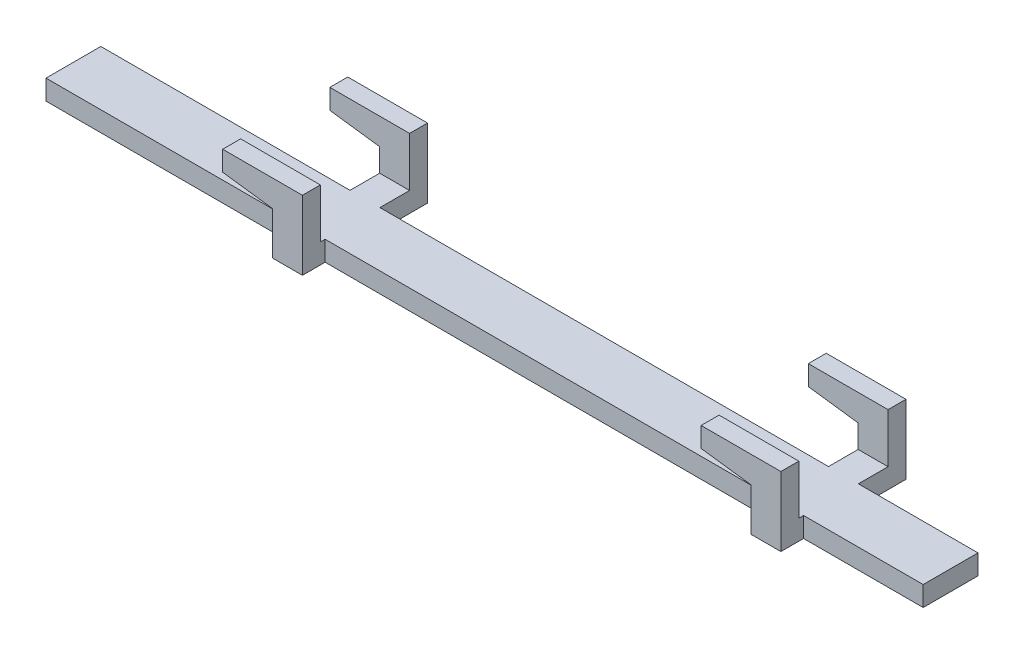
ISO-10303-21;
HEADER;
FILE_DESCRIPTION(('STEP AP214'),'2;1');
FILE_NAME('part.step','',(''),(''),'','','');
FILE_SCHEMA(('AUTOMOTIVE_DESIGN { 1 0 10303 214 1 1 1 1 }'));
ENDSEC;
DATA;
#1=APPLICATION_CONTEXT('core data for automotive mechanical design processes');
#2=APPLICATION_PROTOCOL_DEFINITION('international standard','automotive_design',2000,#1);
#3=PRODUCT_CONTEXT('',#1,'mechanical');
#4=PRODUCT('Part','Part','',(#3));
#5=PRODUCT_RELATED_PRODUCT_CATEGORY('part','',(#4));
#6=PRODUCT_DEFINITION_FORMATION('','',#4);
#7=PRODUCT_DEFINITION_CONTEXT('part definition',#1,'design');
#8=PRODUCT_DEFINITION('design','',#6,#7);
#9=PRODUCT_DEFINITION_SHAPE('','',#8);
#10=(LENGTH_UNIT() NAMED_UNIT(*) SI_UNIT(.MILLI.,.METRE.));
#11=(NAMED_UNIT(*) PLANE_ANGLE_UNIT() SI_UNIT($,.RADIAN.));
#12=(NAMED_UNIT(*) SI_UNIT($,.STERADIAN.) SOLID_ANGLE_UNIT());
#13=UNCERTAINTY_MEASURE_WITH_UNIT(LENGTH_MEASURE(1.E-05),#10,'distance_accuracy_value','');
#14=(GEOMETRIC_REPRESENTATION_CONTEXT(3) GLOBAL_UNCERTAINTY_ASSIGNED_CONTEXT((#13)) GLOBAL_UNIT_ASSIGNED_CONTEXT((#10,
#11,#12)) REPRESENTATION_CONTEXT('',''));
#15=CARTESIAN_POINT('',(0.,0.,0.));
#16=DIRECTION('',(0.,0.,1.));
#17=DIRECTION('',(1.,0.,0.));
#18=AXIS2_PLACEMENT_3D('',#15,#16,#17);
#19=CARTESIAN_POINT('',(-88.,2.,0.));
#20=DIRECTION('',(1.,0.,0.));
#21=DIRECTION('',(0.,0.,-1.));
#22=AXIS2_PLACEMENT_3D('',#19,#20,#21);
#23=PLANE('',#22);
#24=DIRECTION('',(0.,0.,1.));
#25=VECTOR('',#24,1.);
#26=CARTESIAN_POINT('',(-88.,4.,0.));
#27=LINE('',#26,#25);
#28=CARTESIAN_POINT('',(-88.,4.,0.));
#29=VERTEX_POINT('',#28);
#30=CARTESIAN_POINT('',(-88.,4.,5.5));
#31=VERTEX_POINT('',#30);
#32=EDGE_CURVE('E413',#29,#31,#27,.T.);
#33=ORIENTED_EDGE('',*,*,#32,.F.);
#34=DIRECTION('',(0.,1.,0.));
#35=VECTOR('',#34,1.);
#36=CARTESIAN_POINT('',(-88.,2.,0.));
#37=LINE('',#36,#35);
#38=CARTESIAN_POINT('',(-88.,2.,0.));
#39=VERTEX_POINT('',#38);
#40=EDGE_CURVE('E461',#39,#29,#37,.T.);
#41=ORIENTED_EDGE('',*,*,#40,.F.);
#42=DIRECTION('',(0.,0.,1.));
#43=VECTOR('',#42,1.);
#44=CARTESIAN_POINT('',(-88.,2.,0.));
#45=LINE('',#44,#43);
#46=CARTESIAN_POINT('',(-88.,2.,5.5));
#47=VERTEX_POINT('',#46);
#48=EDGE_CURVE('E414',#39,#47,#45,.T.);
#49=ORIENTED_EDGE('',*,*,#48,.T.);
#50=DIRECTION('',(0.,1.,0.));
#51=VECTOR('',#50,1.);
#52=CARTESIAN_POINT('',(-88.,2.,5.5));
#53=LINE('',#52,#51);
#54=EDGE_CURVE('E538',#47,#31,#53,.T.);
#55=ORIENTED_EDGE('',*,*,#54,.T.);
#56=EDGE_LOOP('',(#33,#41,#49,#55));
#57=FACE_BOUND('',#56,.T.);
#58=ADVANCED_FACE('F35',(#57),#23,.F.);
#59=CARTESIAN_POINT('',(-88.,2.,5.5));
#60=DIRECTION('',(0.,0.,-1.));
#61=DIRECTION('',(-1.,0.,0.));
#62=AXIS2_PLACEMENT_3D('',#59,#60,#61);
#63=PLANE('',#62);
#64=DIRECTION('',(1.,0.,0.));
#65=VECTOR('',#64,1.);
#66=CARTESIAN_POINT('',(-88.,4.,5.5));
#67=LINE('',#66,#65);
#68=CARTESIAN_POINT('',(-63.,4.,5.5));
#69=VERTEX_POINT('',#68);
#70=EDGE_CURVE('E464',#31,#69,#67,.T.);
#71=ORIENTED_EDGE('',*,*,#70,.F.);
#72=ORIENTED_EDGE('',*,*,#54,.F.);
#73=DIRECTION('',(1.,0.,0.));
#74=VECTOR('',#73,1.);
#75=CARTESIAN_POINT('',(-88.,2.,5.5));
#76=LINE('',#75,#74);
#77=CARTESIAN_POINT('',(-63.,2.,5.5));
#78=VERTEX_POINT('',#77);
#79=EDGE_CURVE('E417',#47,#78,#76,.T.);
#80=ORIENTED_EDGE('',*,*,#79,.T.);
#81=DIRECTION('',(0.,1.,0.));
#82=VECTOR('',#81,1.);
#83=CARTESIAN_POINT('',(-63.,2.,5.5));
#84=LINE('',#83,#82);
#85=EDGE_CURVE('E535',#78,#69,#84,.T.);
#86=ORIENTED_EDGE('',*,*,#85,.T.);
#87=EDGE_LOOP('',(#71,#72,#80,#86));
#88=FACE_BOUND('',#87,.T.);
#89=ADVANCED_FACE('F629',(#88),#63,.F.);
#90=CARTESIAN_POINT('',(-63.,2.,6.87500000000001));
#91=DIRECTION('',(1.,0.,0.));
#92=DIRECTION('',(0.,0.,-1.));
#93=AXIS2_PLACEMENT_3D('',#90,#91,#92);
#94=PLANE('',#93);
#95=DIRECTION('',(0.,0.,1.));
#96=VECTOR('',#95,1.);
#97=CARTESIAN_POINT('',(-63.,4.,6.87500000000001));
#98=LINE('',#97,#96);
#99=CARTESIAN_POINT('',(-63.,4.,5.975));
#100=VERTEX_POINT('',#99);
#101=EDGE_CURVE('E467',#69,#100,#98,.T.);
#102=ORIENTED_EDGE('',*,*,#101,.F.);
#103=ORIENTED_EDGE('',*,*,#85,.F.);
#104=DIRECTION('',(0.,0.,1.));
#105=VECTOR('',#104,1.);
#106=CARTESIAN_POINT('',(-63.,2.,6.87500000000001));
#107=LINE('',#106,#105);
#108=CARTESIAN_POINT('',(-63.,2.,7.775));
#109=VERTEX_POINT('',#108);
#110=EDGE_CURVE('E421',#78,#109,#107,.T.);
#111=ORIENTED_EDGE('',*,*,#110,.T.);
#112=DIRECTION('',(0.,1.,0.));
#113=VECTOR('',#112,1.);
#114=CARTESIAN_POINT('',(-63.,6.3,7.775));
#115=LINE('',#114,#113);
#116=CARTESIAN_POINT('',(-63.,6.3,7.775));
#117=VERTEX_POINT('',#116);
#118=EDGE_CURVE('E309',#109,#117,#115,.T.);
#119=ORIENTED_EDGE('',*,*,#118,.T.);
#120=DIRECTION('',(0.,0.,-1.));
#121=VECTOR('',#120,1.);
#122=CARTESIAN_POINT('',(-63.,6.3,7.775));
#123=LINE('',#122,#121);
#124=CARTESIAN_POINT('',(-63.,6.3,5.975));
#125=VERTEX_POINT('',#124);
#126=EDGE_CURVE('E332',#117,#125,#123,.T.);
#127=ORIENTED_EDGE('',*,*,#126,.T.);
#128=DIRECTION('',(0.,1.,0.));
#129=VECTOR('',#128,1.);
#130=CARTESIAN_POINT('',(-63.,6.3,5.975));
#131=LINE('',#130,#129);
#132=EDGE_CURVE('E297',#100,#125,#131,.T.);
#133=ORIENTED_EDGE('',*,*,#132,.F.);
#134=EDGE_LOOP('',(#102,#103,#111,#119,#127,#133));
#135=FACE_BOUND('',#134,.T.);
#136=ADVANCED_FACE('F632',(#135),#94,.F.);
#137=CARTESIAN_POINT('',(-60.,2.,5.5));
#138=DIRECTION('',(-1.,0.,0.));
#139=DIRECTION('',(0.,0.,1.));
#140=AXIS2_PLACEMENT_3D('',#137,#138,#139);
#141=PLANE('',#140);
#142=DIRECTION('',(0.,0.,-1.));
#143=VECTOR('',#142,1.);
#144=CARTESIAN_POINT('',(-60.,2.,5.5));
#145=LINE('',#144,#143);
#146=CARTESIAN_POINT('',(-60.,2.,7.775));
#147=VERTEX_POINT('',#146);
#148=CARTESIAN_POINT('',(-60.,2.,5.5));
#149=VERTEX_POINT('',#148);
#150=EDGE_CURVE('E424',#147,#149,#145,.T.);
#151=ORIENTED_EDGE('',*,*,#150,.T.);
#152=DIRECTION('',(0.,1.,0.));
#153=VECTOR('',#152,1.);
#154=CARTESIAN_POINT('',(-60.,2.,5.5));
#155=LINE('',#154,#153);
#156=CARTESIAN_POINT('',(-60.,4.,5.5));
#157=VERTEX_POINT('',#156);
#158=EDGE_CURVE('E532',#149,#157,#155,.T.);
#159=ORIENTED_EDGE('',*,*,#158,.T.);
#160=DIRECTION('',(0.,0.,-1.));
#161=VECTOR('',#160,1.);
#162=CARTESIAN_POINT('',(-60.,4.,5.5));
#163=LINE('',#162,#161);
#164=CARTESIAN_POINT('',(-60.,4.,5.975));
#165=VERTEX_POINT('',#164);
#166=EDGE_CURVE('E470',#165,#157,#163,.T.);
#167=ORIENTED_EDGE('',*,*,#166,.F.);
#168=DIRECTION('',(0.,-1.,0.));
#169=VECTOR('',#168,1.);
#170=CARTESIAN_POINT('',(-60.,2.,5.975));
#171=LINE('',#170,#169);
#172=CARTESIAN_POINT('',(-60.,8.95826248793698,5.975));
#173=VERTEX_POINT('',#172);
#174=EDGE_CURVE('E307',#173,#165,#171,.T.);
#175=ORIENTED_EDGE('',*,*,#174,.F.);
#176=DIRECTION('',(0.,0.,-1.));
#177=VECTOR('',#176,1.);
#178=CARTESIAN_POINT('',(-60.,8.95826248793698,7.775));
#179=LINE('',#178,#177);
#180=CARTESIAN_POINT('',(-60.,8.95826248793698,7.775));
#181=VERTEX_POINT('',#180);
#182=EDGE_CURVE('E325',#181,#173,#179,.T.);
#183=ORIENTED_EDGE('',*,*,#182,.F.);
#184=DIRECTION('',(0.,-1.,0.));
#185=VECTOR('',#184,1.);
#186=CARTESIAN_POINT('',(-60.,2.,7.775));
#187=LINE('',#186,#185);
#188=EDGE_CURVE('E320',#181,#147,#187,.T.);
#189=ORIENTED_EDGE('',*,*,#188,.T.);
#190=EDGE_LOOP('',(#151,#159,#167,#175,#183,#189));
#191=FACE_BOUND('',#190,.T.);
#192=ADVANCED_FACE('F649',(#191),#141,.F.);
#193=CARTESIAN_POINT('',(-60.,2.,5.5));
#194=DIRECTION('',(0.,0.,-1.));
#195=DIRECTION('',(-1.,0.,0.));
#196=AXIS2_PLACEMENT_3D('',#193,#194,#195);
#197=PLANE('',#196);
#198=DIRECTION('',(1.,0.,0.));
#199=VECTOR('',#198,1.);
#200=CARTESIAN_POINT('',(-60.,4.,5.5));
#201=LINE('',#200,#199);
#202=CARTESIAN_POINT('',(-15.,4.,5.5));
#203=VERTEX_POINT('',#202);
#204=EDGE_CURVE('E473',#157,#203,#201,.T.);
#205=ORIENTED_EDGE('',*,*,#204,.F.);
#206=ORIENTED_EDGE('',*,*,#158,.F.);
#207=DIRECTION('',(1.,0.,0.));
#208=VECTOR('',#207,1.);
#209=CARTESIAN_POINT('',(-60.,2.,5.5));
#210=LINE('',#209,#208);
#211=CARTESIAN_POINT('',(-15.,2.,5.5));
#212=VERTEX_POINT('',#211);
#213=EDGE_CURVE('E427',#149,#212,#210,.T.);
#214=ORIENTED_EDGE('',*,*,#213,.T.);
#215=DIRECTION('',(0.,1.,0.));
#216=VECTOR('',#215,1.);
#217=CARTESIAN_POINT('',(-15.,2.,5.5));
#218=LINE('',#217,#216);
#219=EDGE_CURVE('E529',#212,#203,#218,.T.);
#220=ORIENTED_EDGE('',*,*,#219,.T.);
#221=EDGE_LOOP('',(#205,#206,#214,#220));
#222=FACE_BOUND('',#221,.T.);
#223=ADVANCED_FACE('F652',(#222),#197,.F.);
#224=CARTESIAN_POINT('',(-15.,2.,5.5));
#225=DIRECTION('',(1.,0.,0.));
#226=DIRECTION('',(0.,0.,-1.));
#227=AXIS2_PLACEMENT_3D('',#224,#225,#226);
#228=PLANE('',#227);
#229=DIRECTION('',(0.,0.,1.));
#230=VECTOR('',#229,1.);
#231=CARTESIAN_POINT('',(-15.,4.,5.5));
#232=LINE('',#231,#230);
#233=CARTESIAN_POINT('',(-15.,4.,5.975));
#234=VERTEX_POINT('',#233);
#235=EDGE_CURVE('E476',#203,#234,#232,.T.);
#236=ORIENTED_EDGE('',*,*,#235,.F.);
#237=ORIENTED_EDGE('',*,*,#219,.F.);
#238=DIRECTION('',(0.,0.,1.));
#239=VECTOR('',#238,1.);
#240=CARTESIAN_POINT('',(-15.,2.,5.5));
#241=LINE('',#240,#239);
#242=CARTESIAN_POINT('',(-15.,2.,7.775));
#243=VERTEX_POINT('',#242);
#244=EDGE_CURVE('E430',#212,#243,#241,.T.);
#245=ORIENTED_EDGE('',*,*,#244,.T.);
#246=DIRECTION('',(0.,1.,0.));
#247=VECTOR('',#246,1.);
#248=CARTESIAN_POINT('',(-15.,6.3,7.775));
#249=LINE('',#248,#247);
#250=CARTESIAN_POINT('',(-15.,6.3,7.775));
#251=VERTEX_POINT('',#250);
#252=EDGE_CURVE('E387',#243,#251,#249,.T.);
#253=ORIENTED_EDGE('',*,*,#252,.T.);
#254=DIRECTION('',(0.,0.,-1.));
#255=VECTOR('',#254,1.);
#256=CARTESIAN_POINT('',(-15.,6.3,7.775));
#257=LINE('',#256,#255);
#258=CARTESIAN_POINT('',(-15.,6.3,5.975));
#259=VERTEX_POINT('',#258);
#260=EDGE_CURVE('E410',#251,#259,#257,.T.);
#261=ORIENTED_EDGE('',*,*,#260,.T.);
#262=DIRECTION('',(0.,1.,0.));
#263=VECTOR('',#262,1.);
#264=CARTESIAN_POINT('',(-15.,6.3,5.975));
#265=LINE('',#264,#263);
#266=EDGE_CURVE('E366',#234,#259,#265,.T.);
#267=ORIENTED_EDGE('',*,*,#266,.F.);
#268=EDGE_LOOP('',(#236,#237,#245,#253,#261,#267));
#269=FACE_BOUND('',#268,.T.);
#270=ADVANCED_FACE('F655',(#269),#228,.F.);
#271=CARTESIAN_POINT('',(-12.,2.,5.5));
#272=DIRECTION('',(-1.,0.,0.));
#273=DIRECTION('',(0.,0.,1.));
#274=AXIS2_PLACEMENT_3D('',#271,#272,#273);
#275=PLANE('',#274);
#276=DIRECTION('',(0.,0.,-1.));
#277=VECTOR('',#276,1.);
#278=CARTESIAN_POINT('',(-12.,2.,5.5));
#279=LINE('',#278,#277);
#280=CARTESIAN_POINT('',(-12.,2.,7.775));
#281=VERTEX_POINT('',#280);
#282=CARTESIAN_POINT('',(-12.,2.,5.5));
#283=VERTEX_POINT('',#282);
#284=EDGE_CURVE('E433',#281,#283,#279,.T.);
#285=ORIENTED_EDGE('',*,*,#284,.T.);
#286=DIRECTION('',(0.,1.,0.));
#287=VECTOR('',#286,1.);
#288=CARTESIAN_POINT('',(-12.,2.,5.5));
#289=LINE('',#288,#287);
#290=CARTESIAN_POINT('',(-12.,4.,5.5));
#291=VERTEX_POINT('',#290);
#292=EDGE_CURVE('E526',#283,#291,#289,.T.);
#293=ORIENTED_EDGE('',*,*,#292,.T.);
#294=DIRECTION('',(0.,0.,-1.));
#295=VECTOR('',#294,1.);
#296=CARTESIAN_POINT('',(-12.,4.,5.5));
#297=LINE('',#296,#295);
#298=CARTESIAN_POINT('',(-12.,4.,5.975));
#299=VERTEX_POINT('',#298);
#300=EDGE_CURVE('E479',#299,#291,#297,.T.);
#301=ORIENTED_EDGE('',*,*,#300,.F.);
#302=DIRECTION('',(0.,-1.,0.));
#303=VECTOR('',#302,1.);
#304=CARTESIAN_POINT('',(-12.,2.,5.975));
#305=LINE('',#304,#303);
#306=CARTESIAN_POINT('',(-12.,8.95826248793698,5.975));
#307=VERTEX_POINT('',#306);
#308=EDGE_CURVE('E384',#307,#299,#305,.T.);
#309=ORIENTED_EDGE('',*,*,#308,.F.);
#310=DIRECTION('',(0.,0.,-1.));
#311=VECTOR('',#310,1.);
#312=CARTESIAN_POINT('',(-12.,8.95826248793698,7.775));
#313=LINE('',#312,#311);
#314=CARTESIAN_POINT('',(-12.,8.95826248793698,7.775));
#315=VERTEX_POINT('',#314);
#316=EDGE_CURVE('E403',#315,#307,#313,.T.);
#317=ORIENTED_EDGE('',*,*,#316,.F.);
#318=DIRECTION('',(0.,-1.,0.));
#319=VECTOR('',#318,1.);
#320=CARTESIAN_POINT('',(-12.,2.,7.775));
#321=LINE('',#320,#319);
#322=EDGE_CURVE('E398',#315,#281,#321,.T.);
#323=ORIENTED_EDGE('',*,*,#322,.T.);
#324=EDGE_LOOP('',(#285,#293,#301,#309,#317,#323));
#325=FACE_BOUND('',#324,.T.);
#326=ADVANCED_FACE('F663',(#325),#275,.F.);
#327=CARTESIAN_POINT('',(-12.,2.,5.5));
#328=DIRECTION('',(0.,0.,-1.));
#329=DIRECTION('',(-1.,0.,0.));
#330=AXIS2_PLACEMENT_3D('',#327,#328,#329);
#331=PLANE('',#330);
#332=DIRECTION('',(1.,0.,0.));
#333=VECTOR('',#332,1.);
#334=CARTESIAN_POINT('',(-12.,4.,5.5));
#335=LINE('',#334,#333);
#336=CARTESIAN_POINT('',(0.,4.,5.5));
#337=VERTEX_POINT('',#336);
#338=EDGE_CURVE('E482',#291,#337,#335,.T.);
#339=ORIENTED_EDGE('',*,*,#338,.F.);
#340=ORIENTED_EDGE('',*,*,#292,.F.);
#341=DIRECTION('',(1.,0.,0.));
#342=VECTOR('',#341,1.);
#343=CARTESIAN_POINT('',(-12.,2.,5.5));
#344=LINE('',#343,#342);
#345=CARTESIAN_POINT('',(0.,2.,5.5));
#346=VERTEX_POINT('',#345);
#347=EDGE_CURVE('E436',#283,#346,#344,.T.);
#348=ORIENTED_EDGE('',*,*,#347,.T.);
#349=DIRECTION('',(0.,1.,0.));
#350=VECTOR('',#349,1.);
#351=CARTESIAN_POINT('',(0.,2.,5.5));
#352=LINE('',#351,#350);
#353=EDGE_CURVE('E523',#346,#337,#352,.T.);
#354=ORIENTED_EDGE('',*,*,#353,.T.);
#355=EDGE_LOOP('',(#339,#340,#348,#354));
#356=FACE_BOUND('',#355,.T.);
#357=ADVANCED_FACE('F665',(#356),#331,.F.);
#358=CARTESIAN_POINT('',(0.,2.,0.));
#359=DIRECTION('',(-1.,0.,0.));
#360=DIRECTION('',(0.,0.,1.));
#361=AXIS2_PLACEMENT_3D('',#358,#359,#360);
#362=PLANE('',#361);
#363=DIRECTION('',(0.,0.,-1.));
#364=VECTOR('',#363,1.);
#365=CARTESIAN_POINT('',(0.,4.,0.));
#366=LINE('',#365,#364);
#367=CARTESIAN_POINT('',(0.,4.,0.));
#368=VERTEX_POINT('',#367);
#369=EDGE_CURVE('E485',#337,#368,#366,.T.);
#370=ORIENTED_EDGE('',*,*,#369,.F.);
#371=ORIENTED_EDGE('',*,*,#353,.F.);
#372=DIRECTION('',(0.,0.,-1.));
#373=VECTOR('',#372,1.);
#374=CARTESIAN_POINT('',(0.,2.,0.));
#375=LINE('',#374,#373);
#376=CARTESIAN_POINT('',(0.,2.,0.));
#377=VERTEX_POINT('',#376);
#378=EDGE_CURVE('E439',#346,#377,#375,.T.);
#379=ORIENTED_EDGE('',*,*,#378,.T.);
#380=DIRECTION('',(0.,1.,0.));
#381=VECTOR('',#380,1.);
#382=CARTESIAN_POINT('',(0.,2.,0.));
#383=LINE('',#382,#381);
#384=EDGE_CURVE('E520',#377,#368,#383,.T.);
#385=ORIENTED_EDGE('',*,*,#384,.T.);
#386=EDGE_LOOP('',(#370,#371,#379,#385));
#387=FACE_BOUND('',#386,.T.);
#388=ADVANCED_FACE('F561',(#387),#362,.F.);
#389=CARTESIAN_POINT('',(-12.,2.,0.));
#390=DIRECTION('',(0.,0.,1.));
#391=DIRECTION('',(1.,0.,0.));
#392=AXIS2_PLACEMENT_3D('',#389,#390,#391);
#393=PLANE('',#392);
#394=DIRECTION('',(-1.,0.,0.));
#395=VECTOR('',#394,1.);
#396=CARTESIAN_POINT('',(-12.,4.,0.));
#397=LINE('',#396,#395);
#398=CARTESIAN_POINT('',(-12.,4.,0.));
#399=VERTEX_POINT('',#398);
#400=EDGE_CURVE('E488',#368,#399,#397,.T.);
#401=ORIENTED_EDGE('',*,*,#400,.F.);
#402=ORIENTED_EDGE('',*,*,#384,.F.);
#403=DIRECTION('',(-1.,0.,0.));
#404=VECTOR('',#403,1.);
#405=CARTESIAN_POINT('',(-12.,2.,0.));
#406=LINE('',#405,#404);
#407=CARTESIAN_POINT('',(-12.,2.,0.));
#408=VERTEX_POINT('',#407);
#409=EDGE_CURVE('E442',#377,#408,#406,.T.);
#410=ORIENTED_EDGE('',*,*,#409,.T.);
#411=DIRECTION('',(0.,1.,0.));
#412=VECTOR('',#411,1.);
#413=CARTESIAN_POINT('',(-12.,2.,0.));
#414=LINE('',#413,#412);
#415=EDGE_CURVE('E517',#408,#399,#414,.T.);
#416=ORIENTED_EDGE('',*,*,#415,.T.);
#417=EDGE_LOOP('',(#401,#402,#410,#416));
#418=FACE_BOUND('',#417,.T.);
#419=ADVANCED_FACE('F559',(#418),#393,.F.);
#420=CARTESIAN_POINT('',(-12.,2.,0.));
#421=DIRECTION('',(-1.,0.,0.));
#422=DIRECTION('',(0.,0.,1.));
#423=AXIS2_PLACEMENT_3D('',#420,#421,#422);
#424=PLANE('',#423);
#425=DIRECTION('',(0.,0.,-1.));
#426=VECTOR('',#425,1.);
#427=CARTESIAN_POINT('',(-12.,4.,0.));
#428=LINE('',#427,#426);
#429=CARTESIAN_POINT('',(-12.,4.,-2.975));
#430=VERTEX_POINT('',#429);
#431=EDGE_CURVE('E491',#399,#430,#428,.T.);
#432=ORIENTED_EDGE('',*,*,#431,.F.);
#433=ORIENTED_EDGE('',*,*,#415,.F.);
#434=DIRECTION('',(0.,0.,-1.));
#435=VECTOR('',#434,1.);
#436=CARTESIAN_POINT('',(-12.,2.,0.));
#437=LINE('',#436,#435);
#438=CARTESIAN_POINT('',(-12.,2.,-4.775));
#439=VERTEX_POINT('',#438);
#440=EDGE_CURVE('E445',#408,#439,#437,.T.);
#441=ORIENTED_EDGE('',*,*,#440,.T.);
#442=DIRECTION('',(0.,-1.,0.));
#443=VECTOR('',#442,1.);
#444=CARTESIAN_POINT('',(-12.,2.,-4.775));
#445=LINE('',#444,#443);
#446=CARTESIAN_POINT('',(-12.,8.95826248793698,-4.775));
#447=VERTEX_POINT('',#446);
#448=EDGE_CURVE('E351',#447,#439,#445,.T.);
#449=ORIENTED_EDGE('',*,*,#448,.F.);
#450=DIRECTION('',(0.,0.,1.));
#451=VECTOR('',#450,1.);
#452=CARTESIAN_POINT('',(-12.,8.95826248793698,-4.775));
#453=LINE('',#452,#451);
#454=CARTESIAN_POINT('',(-12.,8.95826248793698,-2.975));
#455=VERTEX_POINT('',#454);
#456=EDGE_CURVE('E363',#447,#455,#453,.T.);
#457=ORIENTED_EDGE('',*,*,#456,.T.);
#458=DIRECTION('',(0.,-1.,0.));
#459=VECTOR('',#458,1.);
#460=CARTESIAN_POINT('',(-12.,2.,-2.975));
#461=LINE('',#460,#459);
#462=EDGE_CURVE('E337',#455,#430,#461,.T.);
#463=ORIENTED_EDGE('',*,*,#462,.T.);
#464=EDGE_LOOP('',(#432,#433,#441,#449,#457,#463));
#465=FACE_BOUND('',#464,.T.);
#466=ADVANCED_FACE('F552',(#465),#424,.F.);
#467=CARTESIAN_POINT('',(-15.,2.,-3.875));
#468=DIRECTION('',(1.,0.,0.));
#469=DIRECTION('',(0.,0.,-1.));
#470=AXIS2_PLACEMENT_3D('',#467,#468,#469);
#471=PLANE('',#470);
#472=DIRECTION('',(0.,1.,0.));
#473=VECTOR('',#472,1.);
#474=CARTESIAN_POINT('',(-15.,2.,0.));
#475=LINE('',#474,#473);
#476=CARTESIAN_POINT('',(-15.,2.,0.));
#477=VERTEX_POINT('',#476);
#478=CARTESIAN_POINT('',(-15.,4.,0.));
#479=VERTEX_POINT('',#478);
#480=EDGE_CURVE('E514',#477,#479,#475,.T.);
#481=ORIENTED_EDGE('',*,*,#480,.T.);
#482=DIRECTION('',(0.,0.,1.));
#483=VECTOR('',#482,1.);
#484=CARTESIAN_POINT('',(-15.,4.,-3.875));
#485=LINE('',#484,#483);
#486=CARTESIAN_POINT('',(-15.,4.,-2.975));
#487=VERTEX_POINT('',#486);
#488=EDGE_CURVE('E494',#487,#479,#485,.T.);
#489=ORIENTED_EDGE('',*,*,#488,.F.);
#490=DIRECTION('',(0.,1.,0.));
#491=VECTOR('',#490,1.);
#492=CARTESIAN_POINT('',(-15.,2.,-2.975));
#493=LINE('',#492,#491);
#494=CARTESIAN_POINT('',(-15.,6.3,-2.975));
#495=VERTEX_POINT('',#494);
#496=EDGE_CURVE('E340',#487,#495,#493,.T.);
#497=ORIENTED_EDGE('',*,*,#496,.T.);
#498=DIRECTION('',(0.,0.,1.));
#499=VECTOR('',#498,1.);
#500=CARTESIAN_POINT('',(-15.,6.3,-4.775));
#501=LINE('',#500,#499);
#502=CARTESIAN_POINT('',(-15.,6.3,-4.775));
#503=VERTEX_POINT('',#502);
#504=EDGE_CURVE('E369',#503,#495,#501,.T.);
#505=ORIENTED_EDGE('',*,*,#504,.F.);
#506=DIRECTION('',(0.,1.,0.));
#507=VECTOR('',#506,1.);
#508=CARTESIAN_POINT('',(-15.,2.,-4.775));
#509=LINE('',#508,#507);
#510=CARTESIAN_POINT('',(-15.,2.,-4.775));
#511=VERTEX_POINT('',#510);
#512=EDGE_CURVE('E356',#511,#503,#509,.T.);
#513=ORIENTED_EDGE('',*,*,#512,.F.);
#514=DIRECTION('',(0.,0.,1.));
#515=VECTOR('',#514,1.);
#516=CARTESIAN_POINT('',(-15.,2.,-3.875));
#517=LINE('',#516,#515);
#518=EDGE_CURVE('E448',#511,#477,#517,.T.);
#519=ORIENTED_EDGE('',*,*,#518,.T.);
#520=EDGE_LOOP('',(#481,#489,#497,#505,#513,#519));
#521=FACE_BOUND('',#520,.T.);
#522=ADVANCED_FACE('F585',(#521),#471,.F.);
#523=CARTESIAN_POINT('',(-60.,2.,0.));
#524=DIRECTION('',(0.,0.,1.));
#525=DIRECTION('',(1.,0.,0.));
#526=AXIS2_PLACEMENT_3D('',#523,#524,#525);
#527=PLANE('',#526);
#528=DIRECTION('',(-1.,0.,0.));
#529=VECTOR('',#528,1.);
#530=CARTESIAN_POINT('',(-60.,4.,0.));
#531=LINE('',#530,#529);
#532=CARTESIAN_POINT('',(-60.,4.,0.));
#533=VERTEX_POINT('',#532);
#534=EDGE_CURVE('E497',#479,#533,#531,.T.);
#535=ORIENTED_EDGE('',*,*,#534,.F.);
#536=ORIENTED_EDGE('',*,*,#480,.F.);
#537=DIRECTION('',(-1.,0.,0.));
#538=VECTOR('',#537,1.);
#539=CARTESIAN_POINT('',(-60.,2.,0.));
#540=LINE('',#539,#538);
#541=CARTESIAN_POINT('',(-60.,2.,0.));
#542=VERTEX_POINT('',#541);
#543=EDGE_CURVE('E451',#477,#542,#540,.T.);
#544=ORIENTED_EDGE('',*,*,#543,.T.);
#545=DIRECTION('',(0.,1.,0.));
#546=VECTOR('',#545,1.);
#547=CARTESIAN_POINT('',(-60.,2.,0.));
#548=LINE('',#547,#546);
#549=EDGE_CURVE('E511',#542,#533,#548,.T.);
#550=ORIENTED_EDGE('',*,*,#549,.T.);
#551=EDGE_LOOP('',(#535,#536,#544,#550));
#552=FACE_BOUND('',#551,.T.);
#553=ADVANCED_FACE('F588',(#552),#527,.F.);
#554=CARTESIAN_POINT('',(-60.,2.,0.));
#555=DIRECTION('',(-1.,0.,0.));
#556=DIRECTION('',(0.,0.,1.));
#557=AXIS2_PLACEMENT_3D('',#554,#555,#556);
#558=PLANE('',#557);
#559=DIRECTION('',(0.,0.,-1.));
#560=VECTOR('',#559,1.);
#561=CARTESIAN_POINT('',(-60.,4.,0.));
#562=LINE('',#561,#560);
#563=CARTESIAN_POINT('',(-60.,4.,-2.975));
#564=VERTEX_POINT('',#563);
#565=EDGE_CURVE('E500',#533,#564,#562,.T.);
#566=ORIENTED_EDGE('',*,*,#565,.F.);
#567=ORIENTED_EDGE('',*,*,#549,.F.);
#568=DIRECTION('',(0.,0.,-1.));
#569=VECTOR('',#568,1.);
#570=CARTESIAN_POINT('',(-60.,2.,0.));
#571=LINE('',#570,#569);
#572=CARTESIAN_POINT('',(-60.,2.,-4.775));
#573=VERTEX_POINT('',#572);
#574=EDGE_CURVE('E454',#542,#573,#571,.T.);
#575=ORIENTED_EDGE('',*,*,#574,.T.);
#576=DIRECTION('',(0.,-1.,0.));
#577=VECTOR('',#576,1.);
#578=CARTESIAN_POINT('',(-60.,2.00000000000001,-4.775));
#579=LINE('',#578,#577);
#580=CARTESIAN_POINT('',(-60.,8.95826248793698,-4.775));
#581=VERTEX_POINT('',#580);
#582=EDGE_CURVE('E286',#581,#573,#579,.T.);
#583=ORIENTED_EDGE('',*,*,#582,.F.);
#584=DIRECTION('',(0.,0.,1.));
#585=VECTOR('',#584,1.);
#586=CARTESIAN_POINT('',(-60.,8.95826248793698,-4.775));
#587=LINE('',#586,#585);
#588=CARTESIAN_POINT('',(-60.,8.95826248793698,-2.975));
#589=VERTEX_POINT('',#588);
#590=EDGE_CURVE('E270',#581,#589,#587,.T.);
#591=ORIENTED_EDGE('',*,*,#590,.T.);
#592=DIRECTION('',(0.,-1.,0.));
#593=VECTOR('',#592,1.);
#594=CARTESIAN_POINT('',(-60.,2.00000000000001,-2.975));
#595=LINE('',#594,#593);
#596=EDGE_CURVE('E276',#589,#564,#595,.T.);
#597=ORIENTED_EDGE('',*,*,#596,.T.);
#598=EDGE_LOOP('',(#566,#567,#575,#583,#591,#597));
#599=FACE_BOUND('',#598,.T.);
#600=ADVANCED_FACE('F283',(#599),#558,.F.);
#601=CARTESIAN_POINT('',(-63.,2.,-3.87499999999999));
#602=DIRECTION('',(1.,0.,0.));
#603=DIRECTION('',(0.,0.,-1.));
#604=AXIS2_PLACEMENT_3D('',#601,#602,#603);
#605=PLANE('',#604);
#606=DIRECTION('',(0.,1.,0.));
#607=VECTOR('',#606,1.);
#608=CARTESIAN_POINT('',(-63.,2.,0.));
#609=LINE('',#608,#607);
#610=CARTESIAN_POINT('',(-63.,2.,0.));
#611=VERTEX_POINT('',#610);
#612=CARTESIAN_POINT('',(-63.,4.,0.));
#613=VERTEX_POINT('',#612);
#614=EDGE_CURVE('E508',#611,#613,#609,.T.);
#615=ORIENTED_EDGE('',*,*,#614,.T.);
#616=DIRECTION('',(0.,0.,1.));
#617=VECTOR('',#616,1.);
#618=CARTESIAN_POINT('',(-63.,4.,-3.87499999999999));
#619=LINE('',#618,#617);
#620=CARTESIAN_POINT('',(-63.,4.,-2.975));
#621=VERTEX_POINT('',#620);
#622=EDGE_CURVE('E502',#621,#613,#619,.T.);
#623=ORIENTED_EDGE('',*,*,#622,.F.);
#624=DIRECTION('',(0.,1.,0.));
#625=VECTOR('',#624,1.);
#626=CARTESIAN_POINT('',(-63.,2.,-2.975));
#627=LINE('',#626,#625);
#628=CARTESIAN_POINT('',(-63.,6.3,-2.975));
#629=VERTEX_POINT('',#628);
#630=EDGE_CURVE('E281',#621,#629,#627,.T.);
#631=ORIENTED_EDGE('',*,*,#630,.T.);
#632=DIRECTION('',(0.,0.,1.));
#633=VECTOR('',#632,1.);
#634=CARTESIAN_POINT('',(-63.,6.3,-4.775));
#635=LINE('',#634,#633);
#636=CARTESIAN_POINT('',(-63.,6.3,-4.775));
#637=VERTEX_POINT('',#636);
#638=EDGE_CURVE('E287',#637,#629,#635,.T.);
#639=ORIENTED_EDGE('',*,*,#638,.F.);
#640=DIRECTION('',(0.,1.,0.));
#641=VECTOR('',#640,1.);
#642=CARTESIAN_POINT('',(-63.,2.,-4.775));
#643=LINE('',#642,#641);
#644=CARTESIAN_POINT('',(-63.,2.,-4.775));
#645=VERTEX_POINT('',#644);
#646=EDGE_CURVE('E594',#645,#637,#643,.T.);
#647=ORIENTED_EDGE('',*,*,#646,.F.);
#648=DIRECTION('',(0.,0.,1.));
#649=VECTOR('',#648,1.);
#650=CARTESIAN_POINT('',(-63.,2.,-3.87499999999999));
#651=LINE('',#650,#649);
#652=EDGE_CURVE('E456',#645,#611,#651,.T.);
#653=ORIENTED_EDGE('',*,*,#652,.T.);
#654=EDGE_LOOP('',(#615,#623,#631,#639,#647,#653));
#655=FACE_BOUND('',#654,.T.);
#656=ADVANCED_FACE('F619',(#655),#605,.F.);
#657=CARTESIAN_POINT('',(-88.,2.,0.));
#658=DIRECTION('',(0.,0.,1.));
#659=DIRECTION('',(1.,0.,0.));
#660=AXIS2_PLACEMENT_3D('',#657,#658,#659);
#661=PLANE('',#660);
#662=DIRECTION('',(-1.,0.,0.));
#663=VECTOR('',#662,1.);
#664=CARTESIAN_POINT('',(-88.,4.,0.));
#665=LINE('',#664,#663);
#666=EDGE_CURVE('E418',#613,#29,#665,.T.);
#667=ORIENTED_EDGE('',*,*,#666,.F.);
#668=ORIENTED_EDGE('',*,*,#614,.F.);
#669=DIRECTION('',(-1.,0.,0.));
#670=VECTOR('',#669,1.);
#671=CARTESIAN_POINT('',(-88.,2.,0.));
#672=LINE('',#671,#670);
#673=EDGE_CURVE('E459',#611,#39,#672,.T.);
#674=ORIENTED_EDGE('',*,*,#673,.T.);
#675=ORIENTED_EDGE('',*,*,#40,.T.);
#676=EDGE_LOOP('',(#667,#668,#674,#675));
#677=FACE_BOUND('',#676,.T.);
#678=ADVANCED_FACE('F624',(#677),#661,.F.);
#679=CARTESIAN_POINT('',(0.,2.,0.));
#680=DIRECTION('',(0.,-1.,0.));
#681=DIRECTION('',(0.,0.,1.));
#682=AXIS2_PLACEMENT_3D('',#679,#680,#681);
#683=PLANE('',#682);
#684=ORIENTED_EDGE('',*,*,#652,.F.);
#685=DIRECTION('',(-1.,0.,0.));
#686=VECTOR('',#685,1.);
#687=CARTESIAN_POINT('',(-15.,2.,-4.775));
#688=LINE('',#687,#686);
#689=EDGE_CURVE('E590',#573,#645,#688,.T.);
#690=ORIENTED_EDGE('',*,*,#689,.F.);
#691=ORIENTED_EDGE('',*,*,#574,.F.);
#692=ORIENTED_EDGE('',*,*,#543,.F.);
#693=ORIENTED_EDGE('',*,*,#518,.F.);
#694=DIRECTION('',(-1.,0.,0.));
#695=VECTOR('',#694,1.);
#696=CARTESIAN_POINT('',(-15.,2.,-4.775));
#697=LINE('',#696,#695);
#698=EDGE_CURVE('E354',#439,#511,#697,.T.);
#699=ORIENTED_EDGE('',*,*,#698,.F.);
#700=ORIENTED_EDGE('',*,*,#440,.F.);
#701=ORIENTED_EDGE('',*,*,#409,.F.);
#702=ORIENTED_EDGE('',*,*,#378,.F.);
#703=ORIENTED_EDGE('',*,*,#347,.F.);
#704=ORIENTED_EDGE('',*,*,#284,.F.);
#705=DIRECTION('',(-1.,0.,0.));
#706=VECTOR('',#705,1.);
#707=CARTESIAN_POINT('',(-15.,2.,7.775));
#708=LINE('',#707,#706);
#709=EDGE_CURVE('E401',#281,#243,#708,.T.);
#710=ORIENTED_EDGE('',*,*,#709,.T.);
#711=ORIENTED_EDGE('',*,*,#244,.F.);
#712=ORIENTED_EDGE('',*,*,#213,.F.);
#713=ORIENTED_EDGE('',*,*,#150,.F.);
#714=DIRECTION('',(-1.,0.,0.));
#715=VECTOR('',#714,1.);
#716=CARTESIAN_POINT('',(-63.,2.,7.775));
#717=LINE('',#716,#715);
#718=EDGE_CURVE('E323',#147,#109,#717,.T.);
#719=ORIENTED_EDGE('',*,*,#718,.T.);
#720=ORIENTED_EDGE('',*,*,#110,.F.);
#721=ORIENTED_EDGE('',*,*,#79,.F.);
#722=ORIENTED_EDGE('',*,*,#48,.F.);
#723=ORIENTED_EDGE('',*,*,#673,.F.);
#724=EDGE_LOOP('',(#684,#690,#691,#692,#693,#699,#700,#701,#702,#703,#704,#710,#711,#712,#713,
#719,#720,#721,#722,#723));
#725=FACE_BOUND('',#724,.T.);
#726=ADVANCED_FACE('F565',(#725),#683,.T.);
#727=CARTESIAN_POINT('',(0.,4.,0.));
#728=DIRECTION('',(0.,-1.,0.));
#729=DIRECTION('',(0.,0.,1.));
#730=AXIS2_PLACEMENT_3D('',#727,#728,#729);
#731=PLANE('',#730);
#732=ORIENTED_EDGE('',*,*,#622,.T.);
#733=ORIENTED_EDGE('',*,*,#666,.T.);
#734=ORIENTED_EDGE('',*,*,#32,.T.);
#735=ORIENTED_EDGE('',*,*,#70,.T.);
#736=ORIENTED_EDGE('',*,*,#101,.T.);
#737=DIRECTION('',(-1.,0.,0.));
#738=VECTOR('',#737,1.);
#739=CARTESIAN_POINT('',(0.,4.,5.975));
#740=LINE('',#739,#738);
#741=EDGE_CURVE('E42',#165,#100,#740,.T.);
#742=ORIENTED_EDGE('',*,*,#741,.F.);
#743=ORIENTED_EDGE('',*,*,#166,.T.);
#744=ORIENTED_EDGE('',*,*,#204,.T.);
#745=ORIENTED_EDGE('',*,*,#235,.T.);
#746=DIRECTION('',(-1.,0.,0.));
#747=VECTOR('',#746,1.);
#748=CARTESIAN_POINT('',(0.,4.,5.975));
#749=LINE('',#748,#747);
#750=EDGE_CURVE('E541',#299,#234,#749,.T.);
#751=ORIENTED_EDGE('',*,*,#750,.F.);
#752=ORIENTED_EDGE('',*,*,#300,.T.);
#753=ORIENTED_EDGE('',*,*,#338,.T.);
#754=ORIENTED_EDGE('',*,*,#369,.T.);
#755=ORIENTED_EDGE('',*,*,#400,.T.);
#756=ORIENTED_EDGE('',*,*,#431,.T.);
#757=DIRECTION('',(1.,0.,0.));
#758=VECTOR('',#757,1.);
#759=CARTESIAN_POINT('',(0.,4.,-2.975));
#760=LINE('',#759,#758);
#761=EDGE_CURVE('E543',#487,#430,#760,.T.);
#762=ORIENTED_EDGE('',*,*,#761,.F.);
#763=ORIENTED_EDGE('',*,*,#488,.T.);
#764=ORIENTED_EDGE('',*,*,#534,.T.);
#765=ORIENTED_EDGE('',*,*,#565,.T.);
#766=DIRECTION('',(1.,0.,0.));
#767=VECTOR('',#766,1.);
#768=CARTESIAN_POINT('',(0.,4.,-2.975));
#769=LINE('',#768,#767);
#770=EDGE_CURVE('E11',#621,#564,#769,.T.);
#771=ORIENTED_EDGE('',*,*,#770,.F.);
#772=EDGE_LOOP('',(#732,#733,#734,#735,#736,#742,#743,#744,#745,#751,#752,#753,#754,#755,#756,
#762,#763,#764,#765,#771));
#773=FACE_BOUND('',#772,.T.);
#774=ADVANCED_FACE('F556',(#773),#731,.F.);
#775=CARTESIAN_POINT('',(0.,4.,5.975));
#776=DIRECTION('',(0.,0.,-1.));
#777=DIRECTION('',(-1.,0.,0.));
#778=AXIS2_PLACEMENT_3D('',#775,#776,#777);
#779=PLANE('',#778);
#780=ORIENTED_EDGE('',*,*,#750,.T.);
#781=ORIENTED_EDGE('',*,*,#266,.T.);
#782=DIRECTION('',(-0.99144486137381,0.130526192220053,0.));
#783=VECTOR('',#782,1.);
#784=CARTESIAN_POINT('',(-20.,6.95826248793698,5.975));
#785=LINE('',#784,#783);
#786=CARTESIAN_POINT('',(-20.,6.95826248793698,5.975));
#787=VERTEX_POINT('',#786);
#788=EDGE_CURVE('E376',#259,#787,#785,.T.);
#789=ORIENTED_EDGE('',*,*,#788,.T.);
#790=DIRECTION('',(0.,1.,0.));
#791=VECTOR('',#790,1.);
#792=CARTESIAN_POINT('',(-20.,8.95826248793698,5.975));
#793=LINE('',#792,#791);
#794=CARTESIAN_POINT('',(-20.,8.95826248793698,5.975));
#795=VERTEX_POINT('',#794);
#796=EDGE_CURVE('E379',#787,#795,#793,.T.);
#797=ORIENTED_EDGE('',*,*,#796,.T.);
#798=DIRECTION('',(1.,0.,0.));
#799=VECTOR('',#798,1.);
#800=CARTESIAN_POINT('',(-12.,8.95826248793698,5.975));
#801=LINE('',#800,#799);
#802=EDGE_CURVE('E382',#795,#307,#801,.T.);
#803=ORIENTED_EDGE('',*,*,#802,.T.);
#804=ORIENTED_EDGE('',*,*,#308,.T.);
#805=EDGE_LOOP('',(#780,#781,#789,#797,#803,#804));
#806=FACE_BOUND('',#805,.T.);
#807=ADVANCED_FACE('F659',(#806),#779,.T.);
#808=CARTESIAN_POINT('',(-20.,6.95826248793698,7.775));
#809=DIRECTION('',(0.130526192220053,0.99144486137381,0.));
#810=DIRECTION('',(0.99144486137381,-0.130526192220053,0.));
#811=AXIS2_PLACEMENT_3D('',#808,#809,#810);
#812=PLANE('',#811);
#813=ORIENTED_EDGE('',*,*,#260,.F.);
#814=DIRECTION('',(-0.99144486137381,0.130526192220053,0.));
#815=VECTOR('',#814,1.);
#816=CARTESIAN_POINT('',(-20.,6.95826248793698,7.775));
#817=LINE('',#816,#815);
#818=CARTESIAN_POINT('',(-20.,6.95826248793698,7.775));
#819=VERTEX_POINT('',#818);
#820=EDGE_CURVE('E390',#251,#819,#817,.T.);
#821=ORIENTED_EDGE('',*,*,#820,.T.);
#822=DIRECTION('',(0.,0.,-1.));
#823=VECTOR('',#822,1.);
#824=CARTESIAN_POINT('',(-20.,6.95826248793698,7.775));
#825=LINE('',#824,#823);
#826=EDGE_CURVE('E408',#819,#787,#825,.T.);
#827=ORIENTED_EDGE('',*,*,#826,.T.);
#828=ORIENTED_EDGE('',*,*,#788,.F.);
#829=EDGE_LOOP('',(#813,#821,#827,#828));
#830=FACE_BOUND('',#829,.T.);
#831=ADVANCED_FACE('F794',(#830),#812,.F.);
#832=CARTESIAN_POINT('',(-20.,8.95826248793698,7.775));
#833=DIRECTION('',(1.,0.,0.));
#834=DIRECTION('',(0.,0.,-1.));
#835=AXIS2_PLACEMENT_3D('',#832,#833,#834);
#836=PLANE('',#835);
#837=ORIENTED_EDGE('',*,*,#826,.F.);
#838=DIRECTION('',(0.,1.,0.));
#839=VECTOR('',#838,1.);
#840=CARTESIAN_POINT('',(-20.,8.95826248793698,7.775));
#841=LINE('',#840,#839);
#842=CARTESIAN_POINT('',(-20.,8.95826248793698,7.775));
#843=VERTEX_POINT('',#842);
#844=EDGE_CURVE('E393',#819,#843,#841,.T.);
#845=ORIENTED_EDGE('',*,*,#844,.T.);
#846=DIRECTION('',(0.,0.,-1.));
#847=VECTOR('',#846,1.);
#848=CARTESIAN_POINT('',(-20.,8.95826248793698,7.775));
#849=LINE('',#848,#847);
#850=EDGE_CURVE('E406',#843,#795,#849,.T.);
#851=ORIENTED_EDGE('',*,*,#850,.T.);
#852=ORIENTED_EDGE('',*,*,#796,.F.);
#853=EDGE_LOOP('',(#837,#845,#851,#852));
#854=FACE_BOUND('',#853,.T.);
#855=ADVANCED_FACE('F803',(#854),#836,.F.);
#856=CARTESIAN_POINT('',(-12.,8.95826248793698,7.775));
#857=DIRECTION('',(0.,-1.,0.));
#858=DIRECTION('',(-1.,0.,0.));
#859=AXIS2_PLACEMENT_3D('',#856,#857,#858);
#860=PLANE('',#859);
#861=ORIENTED_EDGE('',*,*,#850,.F.);
#862=DIRECTION('',(1.,0.,0.));
#863=VECTOR('',#862,1.);
#864=CARTESIAN_POINT('',(-12.,8.95826248793698,7.775));
#865=LINE('',#864,#863);
#866=EDGE_CURVE('E396',#843,#315,#865,.T.);
#867=ORIENTED_EDGE('',*,*,#866,.T.);
#868=ORIENTED_EDGE('',*,*,#316,.T.);
#869=ORIENTED_EDGE('',*,*,#802,.F.);
#870=EDGE_LOOP('',(#861,#867,#868,#869));
#871=FACE_BOUND('',#870,.T.);
#872=ADVANCED_FACE('F813',(#871),#860,.F.);
#873=CARTESIAN_POINT('',(0.,4.,7.775));
#874=DIRECTION('',(0.,0.,-1.));
#875=DIRECTION('',(-1.,0.,0.));
#876=AXIS2_PLACEMENT_3D('',#873,#874,#875);
#877=PLANE('',#876);
#878=ORIENTED_EDGE('',*,*,#252,.F.);
#879=ORIENTED_EDGE('',*,*,#709,.F.);
#880=ORIENTED_EDGE('',*,*,#322,.F.);
#881=ORIENTED_EDGE('',*,*,#866,.F.);
#882=ORIENTED_EDGE('',*,*,#844,.F.);
#883=ORIENTED_EDGE('',*,*,#820,.F.);
#884=EDGE_LOOP('',(#878,#879,#880,#881,#882,#883));
#885=FACE_BOUND('',#884,.T.);
#886=ADVANCED_FACE('F823',(#885),#877,.F.);
#887=CARTESIAN_POINT('',(0.,4.,-2.975));
#888=DIRECTION('',(0.,0.,1.));
#889=DIRECTION('',(1.,0.,0.));
#890=AXIS2_PLACEMENT_3D('',#887,#888,#889);
#891=PLANE('',#890);
#892=ORIENTED_EDGE('',*,*,#761,.T.);
#893=ORIENTED_EDGE('',*,*,#462,.F.);
#894=DIRECTION('',(1.,0.,0.));
#895=VECTOR('',#894,1.);
#896=CARTESIAN_POINT('',(-15.,8.95826248793698,-2.975));
#897=LINE('',#896,#895);
#898=CARTESIAN_POINT('',(-20.,8.95826248793698,-2.975));
#899=VERTEX_POINT('',#898);
#900=EDGE_CURVE('E335',#899,#455,#897,.T.);
#901=ORIENTED_EDGE('',*,*,#900,.F.);
#902=DIRECTION('',(0.,1.,0.));
#903=VECTOR('',#902,1.);
#904=CARTESIAN_POINT('',(-20.,2.,-2.975));
#905=LINE('',#904,#903);
#906=CARTESIAN_POINT('',(-20.,6.95826248793698,-2.975));
#907=VERTEX_POINT('',#906);
#908=EDGE_CURVE('E346',#907,#899,#905,.T.);
#909=ORIENTED_EDGE('',*,*,#908,.F.);
#910=DIRECTION('',(-0.99144486137381,0.130526192220053,0.));
#911=VECTOR('',#910,1.);
#912=CARTESIAN_POINT('',(-14.4435390530296,6.2267405265215,-2.975));
#913=LINE('',#912,#911);
#914=EDGE_CURVE('E343',#495,#907,#913,.T.);
#915=ORIENTED_EDGE('',*,*,#914,.F.);
#916=ORIENTED_EDGE('',*,*,#496,.F.);
#917=EDGE_LOOP('',(#892,#893,#901,#909,#915,#916));
#918=FACE_BOUND('',#917,.T.);
#919=ADVANCED_FACE('F547',(#918),#891,.T.);
#920=CARTESIAN_POINT('',(-15.,8.95826248793698,-4.775));
#921=DIRECTION('',(0.,1.,0.));
#922=DIRECTION('',(1.,0.,0.));
#923=AXIS2_PLACEMENT_3D('',#920,#921,#922);
#924=PLANE('',#923);
#925=ORIENTED_EDGE('',*,*,#456,.F.);
#926=DIRECTION('',(1.,0.,0.));
#927=VECTOR('',#926,1.);
#928=CARTESIAN_POINT('',(-15.,8.95826248793698,-4.775));
#929=LINE('',#928,#927);
#930=CARTESIAN_POINT('',(-20.,8.95826248793698,-4.775));
#931=VERTEX_POINT('',#930);
#932=EDGE_CURVE('E349',#931,#447,#929,.T.);
#933=ORIENTED_EDGE('',*,*,#932,.F.);
#934=DIRECTION('',(0.,0.,1.));
#935=VECTOR('',#934,1.);
#936=CARTESIAN_POINT('',(-20.,8.95826248793698,-4.775));
#937=LINE('',#936,#935);
#938=EDGE_CURVE('E364',#931,#899,#937,.T.);
#939=ORIENTED_EDGE('',*,*,#938,.T.);
#940=ORIENTED_EDGE('',*,*,#900,.T.);
#941=EDGE_LOOP('',(#925,#933,#939,#940));
#942=FACE_BOUND('',#941,.T.);
#943=ADVANCED_FACE('F575',(#942),#924,.T.);
#944=CARTESIAN_POINT('',(-20.,2.,-4.775));
#945=DIRECTION('',(-1.,0.,0.));
#946=DIRECTION('',(0.,0.,1.));
#947=AXIS2_PLACEMENT_3D('',#944,#945,#946);
#948=PLANE('',#947);
#949=ORIENTED_EDGE('',*,*,#938,.F.);
#950=DIRECTION('',(0.,1.,0.));
#951=VECTOR('',#950,1.);
#952=CARTESIAN_POINT('',(-20.,2.,-4.775));
#953=LINE('',#952,#951);
#954=CARTESIAN_POINT('',(-20.,6.95826248793698,-4.775));
#955=VERTEX_POINT('',#954);
#956=EDGE_CURVE('E361',#955,#931,#953,.T.);
#957=ORIENTED_EDGE('',*,*,#956,.F.);
#958=DIRECTION('',(0.,0.,1.));
#959=VECTOR('',#958,1.);
#960=CARTESIAN_POINT('',(-20.,6.95826248793698,-4.775));
#961=LINE('',#960,#959);
#962=EDGE_CURVE('E367',#955,#907,#961,.T.);
#963=ORIENTED_EDGE('',*,*,#962,.T.);
#964=ORIENTED_EDGE('',*,*,#908,.T.);
#965=EDGE_LOOP('',(#949,#957,#963,#964));
#966=FACE_BOUND('',#965,.T.);
#967=ADVANCED_FACE('F578',(#966),#948,.T.);
#968=CARTESIAN_POINT('',(-14.4435390530296,6.2267405265215,-4.775));
#969=DIRECTION('',(-0.130526192220053,-0.99144486137381,0.));
#970=DIRECTION('',(-0.99144486137381,0.130526192220053,0.));
#971=AXIS2_PLACEMENT_3D('',#968,#969,#970);
#972=PLANE('',#971);
#973=ORIENTED_EDGE('',*,*,#962,.F.);
#974=DIRECTION('',(-0.99144486137381,0.130526192220053,0.));
#975=VECTOR('',#974,1.);
#976=CARTESIAN_POINT('',(-14.4435390530296,6.2267405265215,-4.775));
#977=LINE('',#976,#975);
#978=EDGE_CURVE('E359',#503,#955,#977,.T.);
#979=ORIENTED_EDGE('',*,*,#978,.F.);
#980=ORIENTED_EDGE('',*,*,#504,.T.);
#981=ORIENTED_EDGE('',*,*,#914,.T.);
#982=EDGE_LOOP('',(#973,#979,#980,#981));
#983=FACE_BOUND('',#982,.T.);
#984=ADVANCED_FACE('F581',(#983),#972,.T.);
#985=CARTESIAN_POINT('',(0.,4.,-4.775));
#986=DIRECTION('',(0.,0.,1.));
#987=DIRECTION('',(1.,0.,0.));
#988=AXIS2_PLACEMENT_3D('',#985,#986,#987);
#989=PLANE('',#988);
#990=ORIENTED_EDGE('',*,*,#932,.T.);
#991=ORIENTED_EDGE('',*,*,#448,.T.);
#992=ORIENTED_EDGE('',*,*,#698,.T.);
#993=ORIENTED_EDGE('',*,*,#512,.T.);
#994=ORIENTED_EDGE('',*,*,#978,.T.);
#995=ORIENTED_EDGE('',*,*,#956,.T.);
#996=EDGE_LOOP('',(#990,#991,#992,#993,#994,#995));
#997=FACE_BOUND('',#996,.T.);
#998=ADVANCED_FACE('F570',(#997),#989,.F.);
#999=CARTESIAN_POINT('',(-48.,4.,5.975));
#1000=DIRECTION('',(0.,0.,-1.));
#1001=DIRECTION('',(-1.,0.,0.));
#1002=AXIS2_PLACEMENT_3D('',#999,#1000,#1001);
#1003=PLANE('',#1002);
#1004=ORIENTED_EDGE('',*,*,#741,.T.);
#1005=ORIENTED_EDGE('',*,*,#132,.T.);
#1006=DIRECTION('',(-0.99144486137381,0.130526192220053,0.));
#1007=VECTOR('',#1006,1.);
#1008=CARTESIAN_POINT('',(-68.,6.95826248793698,5.975));
#1009=LINE('',#1008,#1007);
#1010=CARTESIAN_POINT('',(-68.,6.95826248793698,5.975));
#1011=VERTEX_POINT('',#1010);
#1012=EDGE_CURVE('E299',#125,#1011,#1009,.T.);
#1013=ORIENTED_EDGE('',*,*,#1012,.T.);
#1014=DIRECTION('',(0.,1.,0.));
#1015=VECTOR('',#1014,1.);
#1016=CARTESIAN_POINT('',(-68.,8.95826248793698,5.975));
#1017=LINE('',#1016,#1015);
#1018=CARTESIAN_POINT('',(-68.,8.95826248793698,5.975));
#1019=VERTEX_POINT('',#1018);
#1020=EDGE_CURVE('E302',#1011,#1019,#1017,.T.);
#1021=ORIENTED_EDGE('',*,*,#1020,.T.);
#1022=DIRECTION('',(1.,0.,0.));
#1023=VECTOR('',#1022,1.);
#1024=CARTESIAN_POINT('',(-60.,8.95826248793698,5.975));
#1025=LINE('',#1024,#1023);
#1026=EDGE_CURVE('E305',#1019,#173,#1025,.T.);
#1027=ORIENTED_EDGE('',*,*,#1026,.T.);
#1028=ORIENTED_EDGE('',*,*,#174,.T.);
#1029=EDGE_LOOP('',(#1004,#1005,#1013,#1021,#1027,#1028));
#1030=FACE_BOUND('',#1029,.T.);
#1031=ADVANCED_FACE('F634',(#1030),#1003,.T.);
#1032=CARTESIAN_POINT('',(-68.,6.95826248793698,7.775));
#1033=DIRECTION('',(0.130526192220053,0.99144486137381,0.));
#1034=DIRECTION('',(0.99144486137381,-0.130526192220053,0.));
#1035=AXIS2_PLACEMENT_3D('',#1032,#1033,#1034);
#1036=PLANE('',#1035);
#1037=ORIENTED_EDGE('',*,*,#126,.F.);
#1038=DIRECTION('',(-0.99144486137381,0.130526192220053,0.));
#1039=VECTOR('',#1038,1.);
#1040=CARTESIAN_POINT('',(-68.,6.95826248793698,7.775));
#1041=LINE('',#1040,#1039);
#1042=CARTESIAN_POINT('',(-68.,6.95826248793698,7.775));
#1043=VERTEX_POINT('',#1042);
#1044=EDGE_CURVE('E312',#117,#1043,#1041,.T.);
#1045=ORIENTED_EDGE('',*,*,#1044,.T.);
#1046=DIRECTION('',(0.,0.,-1.));
#1047=VECTOR('',#1046,1.);
#1048=CARTESIAN_POINT('',(-68.,6.95826248793698,7.775));
#1049=LINE('',#1048,#1047);
#1050=EDGE_CURVE('E330',#1043,#1011,#1049,.T.);
#1051=ORIENTED_EDGE('',*,*,#1050,.T.);
#1052=ORIENTED_EDGE('',*,*,#1012,.F.);
#1053=EDGE_LOOP('',(#1037,#1045,#1051,#1052));
#1054=FACE_BOUND('',#1053,.T.);
#1055=ADVANCED_FACE('F637',(#1054),#1036,.F.);
#1056=CARTESIAN_POINT('',(-68.,8.95826248793698,7.775));
#1057=DIRECTION('',(1.,0.,0.));
#1058=DIRECTION('',(0.,0.,-1.));
#1059=AXIS2_PLACEMENT_3D('',#1056,#1057,#1058);
#1060=PLANE('',#1059);
#1061=ORIENTED_EDGE('',*,*,#1050,.F.);
#1062=DIRECTION('',(0.,1.,0.));
#1063=VECTOR('',#1062,1.);
#1064=CARTESIAN_POINT('',(-68.,8.95826248793698,7.775));
#1065=LINE('',#1064,#1063);
#1066=CARTESIAN_POINT('',(-68.,8.95826248793698,7.775));
#1067=VERTEX_POINT('',#1066);
#1068=EDGE_CURVE('E315',#1043,#1067,#1065,.T.);
#1069=ORIENTED_EDGE('',*,*,#1068,.T.);
#1070=DIRECTION('',(0.,0.,-1.));
#1071=VECTOR('',#1070,1.);
#1072=CARTESIAN_POINT('',(-68.,8.95826248793698,7.775));
#1073=LINE('',#1072,#1071);
#1074=EDGE_CURVE('E328',#1067,#1019,#1073,.T.);
#1075=ORIENTED_EDGE('',*,*,#1074,.T.);
#1076=ORIENTED_EDGE('',*,*,#1020,.F.);
#1077=EDGE_LOOP('',(#1061,#1069,#1075,#1076));
#1078=FACE_BOUND('',#1077,.T.);
#1079=ADVANCED_FACE('F640',(#1078),#1060,.F.);
#1080=CARTESIAN_POINT('',(-60.,8.95826248793698,7.775));
#1081=DIRECTION('',(0.,-1.,0.));
#1082=DIRECTION('',(-1.,0.,0.));
#1083=AXIS2_PLACEMENT_3D('',#1080,#1081,#1082);
#1084=PLANE('',#1083);
#1085=ORIENTED_EDGE('',*,*,#1074,.F.);
#1086=DIRECTION('',(1.,0.,0.));
#1087=VECTOR('',#1086,1.);
#1088=CARTESIAN_POINT('',(-60.,8.95826248793698,7.775));
#1089=LINE('',#1088,#1087);
#1090=EDGE_CURVE('E318',#1067,#181,#1089,.T.);
#1091=ORIENTED_EDGE('',*,*,#1090,.T.);
#1092=ORIENTED_EDGE('',*,*,#182,.T.);
#1093=ORIENTED_EDGE('',*,*,#1026,.F.);
#1094=EDGE_LOOP('',(#1085,#1091,#1092,#1093));
#1095=FACE_BOUND('',#1094,.T.);
#1096=ADVANCED_FACE('F644',(#1095),#1084,.F.);
#1097=CARTESIAN_POINT('',(-48.,4.,7.775));
#1098=DIRECTION('',(0.,0.,-1.));
#1099=DIRECTION('',(-1.,0.,0.));
#1100=AXIS2_PLACEMENT_3D('',#1097,#1098,#1099);
#1101=PLANE('',#1100);
#1102=ORIENTED_EDGE('',*,*,#118,.F.);
#1103=ORIENTED_EDGE('',*,*,#718,.F.);
#1104=ORIENTED_EDGE('',*,*,#188,.F.);
#1105=ORIENTED_EDGE('',*,*,#1090,.F.);
#1106=ORIENTED_EDGE('',*,*,#1068,.F.);
#1107=ORIENTED_EDGE('',*,*,#1044,.F.);
#1108=EDGE_LOOP('',(#1102,#1103,#1104,#1105,#1106,#1107));
#1109=FACE_BOUND('',#1108,.T.);
#1110=ADVANCED_FACE('F906',(#1109),#1101,.F.);
#1111=CARTESIAN_POINT('',(0.,4.,-2.975));
#1112=DIRECTION('',(0.,0.,1.));
#1113=DIRECTION('',(1.,0.,0.));
#1114=AXIS2_PLACEMENT_3D('',#1111,#1112,#1113);
#1115=PLANE('',#1114);
#1116=ORIENTED_EDGE('',*,*,#770,.T.);
#1117=ORIENTED_EDGE('',*,*,#596,.F.);
#1118=DIRECTION('',(1.,0.,0.));
#1119=VECTOR('',#1118,1.);
#1120=CARTESIAN_POINT('',(-15.,8.95826248793697,-2.975));
#1121=LINE('',#1120,#1119);
#1122=CARTESIAN_POINT('',(-68.,8.95826248793698,-2.975));
#1123=VERTEX_POINT('',#1122);
#1124=EDGE_CURVE('E266',#1123,#589,#1121,.T.);
#1125=ORIENTED_EDGE('',*,*,#1124,.F.);
#1126=DIRECTION('',(0.,1.,0.));
#1127=VECTOR('',#1126,1.);
#1128=CARTESIAN_POINT('',(-68.,2.,-2.975));
#1129=LINE('',#1128,#1127);
#1130=CARTESIAN_POINT('',(-68.,6.95826248793698,-2.975));
#1131=VERTEX_POINT('',#1130);
#1132=EDGE_CURVE('E599',#1131,#1123,#1129,.T.);
#1133=ORIENTED_EDGE('',*,*,#1132,.F.);
#1134=DIRECTION('',(-0.99144486137381,0.130526192220053,0.));
#1135=VECTOR('',#1134,1.);
#1136=CARTESIAN_POINT('',(-15.261319222092,0.0150834440609485,-2.975));
#1137=LINE('',#1136,#1135);
#1138=EDGE_CURVE('E611',#629,#1131,#1137,.T.);
#1139=ORIENTED_EDGE('',*,*,#1138,.F.);
#1140=ORIENTED_EDGE('',*,*,#630,.F.);
#1141=EDGE_LOOP('',(#1116,#1117,#1125,#1133,#1139,#1140));
#1142=FACE_BOUND('',#1141,.T.);
#1143=ADVANCED_FACE('F278',(#1142),#1115,.T.);
#1144=CARTESIAN_POINT('',(-15.,8.95826248793697,-4.775));
#1145=DIRECTION('',(0.,1.,0.));
#1146=DIRECTION('',(1.,0.,0.));
#1147=AXIS2_PLACEMENT_3D('',#1144,#1145,#1146);
#1148=PLANE('',#1147);
#1149=ORIENTED_EDGE('',*,*,#590,.F.);
#1150=DIRECTION('',(1.,0.,0.));
#1151=VECTOR('',#1150,1.);
#1152=CARTESIAN_POINT('',(-15.,8.95826248793697,-4.775));
#1153=LINE('',#1152,#1151);
#1154=CARTESIAN_POINT('',(-68.,8.95826248793698,-4.775));
#1155=VERTEX_POINT('',#1154);
#1156=EDGE_CURVE('E597',#1155,#581,#1153,.T.);
#1157=ORIENTED_EDGE('',*,*,#1156,.F.);
#1158=DIRECTION('',(0.,0.,1.));
#1159=VECTOR('',#1158,1.);
#1160=CARTESIAN_POINT('',(-68.,8.95826248793698,-4.775));
#1161=LINE('',#1160,#1159);
#1162=EDGE_CURVE('E273',#1155,#1123,#1161,.T.);
#1163=ORIENTED_EDGE('',*,*,#1162,.T.);
#1164=ORIENTED_EDGE('',*,*,#1124,.T.);
#1165=EDGE_LOOP('',(#1149,#1157,#1163,#1164));
#1166=FACE_BOUND('',#1165,.T.);
#1167=ADVANCED_FACE('F267',(#1166),#1148,.T.);
#1168=CARTESIAN_POINT('',(-68.,2.,-4.775));
#1169=DIRECTION('',(-1.,0.,0.));
#1170=DIRECTION('',(0.,0.,1.));
#1171=AXIS2_PLACEMENT_3D('',#1168,#1169,#1170);
#1172=PLANE('',#1171);
#1173=ORIENTED_EDGE('',*,*,#1162,.F.);
#1174=DIRECTION('',(0.,1.,0.));
#1175=VECTOR('',#1174,1.);
#1176=CARTESIAN_POINT('',(-68.,2.,-4.775));
#1177=LINE('',#1176,#1175);
#1178=CARTESIAN_POINT('',(-68.,6.95826248793698,-4.775));
#1179=VERTEX_POINT('',#1178);
#1180=EDGE_CURVE('E288',#1179,#1155,#1177,.T.);
#1181=ORIENTED_EDGE('',*,*,#1180,.F.);
#1182=DIRECTION('',(0.,0.,1.));
#1183=VECTOR('',#1182,1.);
#1184=CARTESIAN_POINT('',(-68.,6.95826248793698,-4.775));
#1185=LINE('',#1184,#1183);
#1186=EDGE_CURVE('E291',#1179,#1131,#1185,.T.);
#1187=ORIENTED_EDGE('',*,*,#1186,.T.);
#1188=ORIENTED_EDGE('',*,*,#1132,.T.);
#1189=EDGE_LOOP('',(#1173,#1181,#1187,#1188));
#1190=FACE_BOUND('',#1189,.T.);
#1191=ADVANCED_FACE('F609',(#1190),#1172,.T.);
#1192=CARTESIAN_POINT('',(-15.261319222092,0.0150834440609485,-4.775));
#1193=DIRECTION('',(-0.130526192220053,-0.99144486137381,0.));
#1194=DIRECTION('',(-0.99144486137381,0.130526192220053,0.));
#1195=AXIS2_PLACEMENT_3D('',#1192,#1193,#1194);
#1196=PLANE('',#1195);
#1197=ORIENTED_EDGE('',*,*,#1186,.F.);
#1198=DIRECTION('',(-0.99144486137381,0.130526192220053,0.));
#1199=VECTOR('',#1198,1.);
#1200=CARTESIAN_POINT('',(-15.261319222092,0.0150834440609485,-4.775));
#1201=LINE('',#1200,#1199);
#1202=EDGE_CURVE('E293',#637,#1179,#1201,.T.);
#1203=ORIENTED_EDGE('',*,*,#1202,.F.);
#1204=ORIENTED_EDGE('',*,*,#638,.T.);
#1205=ORIENTED_EDGE('',*,*,#1138,.T.);
#1206=EDGE_LOOP('',(#1197,#1203,#1204,#1205));
#1207=FACE_BOUND('',#1206,.T.);
#1208=ADVANCED_FACE('F612',(#1207),#1196,.T.);
#1209=CARTESIAN_POINT('',(0.,4.,-4.775));
#1210=DIRECTION('',(0.,0.,1.));
#1211=DIRECTION('',(1.,0.,0.));
#1212=AXIS2_PLACEMENT_3D('',#1209,#1210,#1211);
#1213=PLANE('',#1212);
#1214=ORIENTED_EDGE('',*,*,#1156,.T.);
#1215=ORIENTED_EDGE('',*,*,#582,.T.);
#1216=ORIENTED_EDGE('',*,*,#689,.T.);
#1217=ORIENTED_EDGE('',*,*,#646,.T.);
#1218=ORIENTED_EDGE('',*,*,#1202,.T.);
#1219=ORIENTED_EDGE('',*,*,#1180,.T.);
#1220=EDGE_LOOP('',(#1214,#1215,#1216,#1217,#1218,#1219));
#1221=FACE_BOUND('',#1220,.T.);
#1222=ADVANCED_FACE('F596',(#1221),#1213,.F.);
#1223=CLOSED_SHELL('',(#58,#89,#136,#192,#223,#270,#326,#357,#388,#419,#466,#522,#553,#600,#656,
#678,#726,#774,#807,#831,#855,#872,#886,#919,#943,#967,#984,#998,#1031,#1055,#1079,#1096,#1110,
#1143,#1167,#1191,#1208,#1222));
#1224=MANIFOLD_SOLID_BREP('B2',#1223);
#1225=ADVANCED_BREP_SHAPE_REPRESENTATION('',(#18,#1224),#14);
#1226=SHAPE_DEFINITION_REPRESENTATION(#9,#1225);
ENDSEC;
END-ISO-10303-21;
